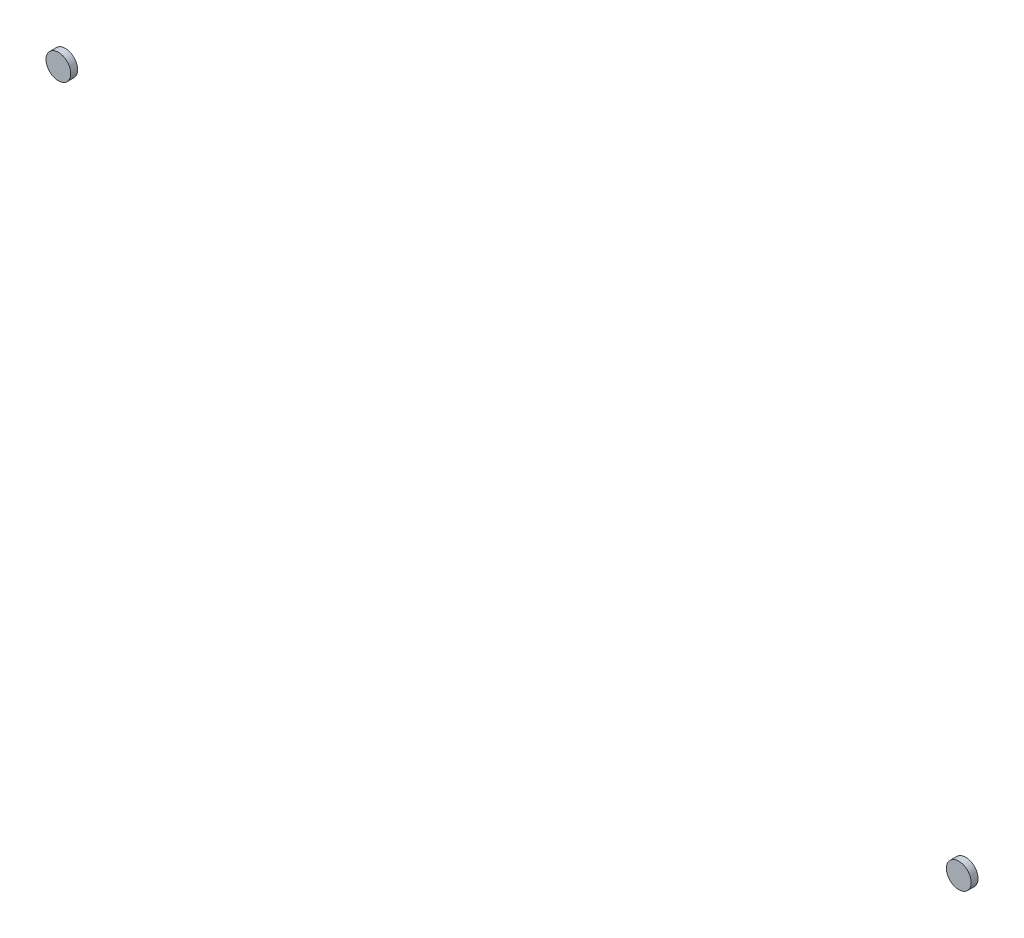
ISO-10303-21;
HEADER;
FILE_DESCRIPTION(('STEP AP214'),'2;1');
FILE_NAME('part.step','',(''),(''),'','','');
FILE_SCHEMA(('AUTOMOTIVE_DESIGN { 1 0 10303 214 1 1 1 1 }'));
ENDSEC;
DATA;
#1=APPLICATION_CONTEXT('core data for automotive mechanical design processes');
#2=APPLICATION_PROTOCOL_DEFINITION('international standard','automotive_design',2000,#1);
#3=PRODUCT_CONTEXT('',#1,'mechanical');
#4=PRODUCT('Part','Part','',(#3));
#5=PRODUCT_RELATED_PRODUCT_CATEGORY('part','',(#4));
#6=PRODUCT_DEFINITION_FORMATION('','',#4);
#7=PRODUCT_DEFINITION_CONTEXT('part definition',#1,'design');
#8=PRODUCT_DEFINITION('design','',#6,#7);
#9=PRODUCT_DEFINITION_SHAPE('','',#8);
#10=(LENGTH_UNIT() NAMED_UNIT(*) SI_UNIT(.MILLI.,.METRE.));
#11=(NAMED_UNIT(*) PLANE_ANGLE_UNIT() SI_UNIT($,.RADIAN.));
#12=(NAMED_UNIT(*) SI_UNIT($,.STERADIAN.) SOLID_ANGLE_UNIT());
#13=UNCERTAINTY_MEASURE_WITH_UNIT(LENGTH_MEASURE(1.E-05),#10,'distance_accuracy_value','');
#14=(GEOMETRIC_REPRESENTATION_CONTEXT(3) GLOBAL_UNCERTAINTY_ASSIGNED_CONTEXT((#13)) GLOBAL_UNIT_ASSIGNED_CONTEXT((#10,
#11,#12)) REPRESENTATION_CONTEXT('',''));
#15=CARTESIAN_POINT('',(0.,0.,0.));
#16=DIRECTION('',(0.,0.,1.));
#17=DIRECTION('',(1.,0.,0.));
#18=AXIS2_PLACEMENT_3D('',#15,#16,#17);
#19=CARTESIAN_POINT('',(13.8400021363873,12.4809647029919,-0.253998963258981));
#20=DIRECTION('',(0.,-8.74227339409092E-08,1.));
#21=DIRECTION('',(1.,-8.74227765734792E-08,0.));
#22=AXIS2_PLACEMENT_3D('',#19,#20,#21);
#23=PLANE('',#22);
#24=CARTESIAN_POINT('',(14.2972021363873,12.4809646630223,-0.253998963258985));
#25=DIRECTION('',(0.,8.74227339409092E-08,-1.));
#26=DIRECTION('',(-1.,8.74227765734792E-08,0.));
#27=AXIS2_PLACEMENT_3D('',#24,#25,#26);
#28=CIRCLE('',#27,0.4572);
#29=CARTESIAN_POINT('',(13.8400021363873,12.480964702992,-0.253998963258982));
#30=VERTEX_POINT('',#29);
#31=EDGE_CURVE('P0_E10',#30,#30,#28,.T.);
#32=ORIENTED_EDGE('',*,*,#31,.T.);
#33=EDGE_LOOP('',(#32));
#34=FACE_BOUND('',#33,.T.);
#35=ADVANCED_FACE('P0_F15',(#34),#23,.F.);
#36=CARTESIAN_POINT('',(13.8400021363873,12.4809646807866,1.0367410172539E-06));
#37=DIRECTION('',(0.,-8.74227339409092E-08,1.));
#38=DIRECTION('',(1.,-8.74227765734792E-08,0.));
#39=AXIS2_PLACEMENT_3D('',#36,#37,#38);
#40=PLANE('',#39);
#41=CARTESIAN_POINT('',(14.2972021363873,12.4809646408169,1.03674101378445E-06));
#42=DIRECTION('',(0.,8.74227339409092E-08,-1.));
#43=DIRECTION('',(-1.,8.74227765734792E-08,0.));
#44=AXIS2_PLACEMENT_3D('',#41,#42,#43);
#45=CIRCLE('',#44,0.4572);
#46=CARTESIAN_POINT('',(13.8400021363873,12.4809646807866,1.03674101727871E-06));
#47=VERTEX_POINT('',#46);
#48=EDGE_CURVE('P0_E22',#47,#47,#45,.T.);
#49=ORIENTED_EDGE('',*,*,#48,.F.);
#50=EDGE_LOOP('',(#49));
#51=FACE_BOUND('',#50,.T.);
#52=ADVANCED_FACE('P0_F35',(#51),#40,.T.);
#53=CARTESIAN_POINT('',(14.2972021363873,12.4809646408169,1.03674101378445E-06));
#54=DIRECTION('',(0.,-8.74227339409092E-08,1.));
#55=DIRECTION('',(-1.,8.74227765734792E-08,0.));
#56=AXIS2_PLACEMENT_3D('',#53,#54,#55);
#57=CYLINDRICAL_SURFACE('',#56,0.4572);
#58=ORIENTED_EDGE('',*,*,#31,.F.);
#59=EDGE_LOOP('',(#58));
#60=FACE_BOUND('',#59,.T.);
#61=ORIENTED_EDGE('',*,*,#48,.T.);
#62=EDGE_LOOP('',(#61));
#63=FACE_BOUND('',#62,.T.);
#64=ADVANCED_FACE('P0_F33',(#60,#63),#57,.T.);
#65=CLOSED_SHELL('',(#35,#52,#64));
#66=MANIFOLD_SOLID_BREP('P0_B1',#65);
#67=CARTESIAN_POINT('',(-18.9777993840402,22.1881646630226,-0.253998923289316));
#68=DIRECTION('',(0.,-8.74227339409095E-08,1.));
#69=DIRECTION('',(-1.19248806384999E-08,-1.,-8.74227339409095E-08));
#70=AXIS2_PLACEMENT_3D('',#67,#68,#69);
#71=PLANE('',#70);
#72=CARTESIAN_POINT('',(-18.9777993894923,21.7309646630225,-0.253998963258991));
#73=DIRECTION('',(0.,8.74227339409095E-08,-1.));
#74=DIRECTION('',(1.19248806384999E-08,1.,8.74227339409095E-08));
#75=AXIS2_PLACEMENT_3D('',#72,#73,#74);
#76=CIRCLE('',#75,0.4572);
#77=CARTESIAN_POINT('',(-18.9777993840402,22.1881646630226,-0.253998923289317));
#78=VERTEX_POINT('',#77);
#79=EDGE_CURVE('P1_E10',#78,#78,#76,.T.);
#80=ORIENTED_EDGE('',*,*,#79,.T.);
#81=EDGE_LOOP('',(#80));
#82=FACE_BOUND('',#81,.T.);
#83=ADVANCED_FACE('P1_F15',(#82),#71,.F.);
#84=CARTESIAN_POINT('',(-18.9777993840402,22.1881646408171,1.07671068285201E-06));
#85=DIRECTION('',(0.,-8.74227339409095E-08,1.));
#86=DIRECTION('',(-1.19248806384999E-08,-1.,-8.74227339409095E-08));
#87=AXIS2_PLACEMENT_3D('',#84,#85,#86);
#88=PLANE('',#87);
#89=CARTESIAN_POINT('',(-18.9777993894923,21.7309646408171,1.03674100901396E-06));
#90=DIRECTION('',(0.,8.74227339409095E-08,-1.));
#91=DIRECTION('',(1.19248806384999E-08,1.,8.74227339409095E-08));
#92=AXIS2_PLACEMENT_3D('',#89,#90,#91);
#93=CIRCLE('',#92,0.4572);
#94=CARTESIAN_POINT('',(-18.9777993840402,22.1881646408171,1.07671068297175E-06));
#95=VERTEX_POINT('',#94);
#96=EDGE_CURVE('P1_E22',#95,#95,#93,.T.);
#97=ORIENTED_EDGE('',*,*,#96,.F.);
#98=EDGE_LOOP('',(#97));
#99=FACE_BOUND('',#98,.T.);
#100=ADVANCED_FACE('P1_F35',(#99),#88,.T.);
#101=CARTESIAN_POINT('',(-18.9777993894923,21.7309646408171,1.03674100901396E-06));
#102=DIRECTION('',(0.,-8.74227339409095E-08,1.));
#103=DIRECTION('',(1.19248806384999E-08,1.,8.74227339409095E-08));
#104=AXIS2_PLACEMENT_3D('',#101,#102,#103);
#105=CYLINDRICAL_SURFACE('',#104,0.4572);
#106=ORIENTED_EDGE('',*,*,#79,.F.);
#107=EDGE_LOOP('',(#106));
#108=FACE_BOUND('',#107,.T.);
#109=ORIENTED_EDGE('',*,*,#96,.T.);
#110=EDGE_LOOP('',(#109));
#111=FACE_BOUND('',#110,.T.);
#112=ADVANCED_FACE('P1_F33',(#108,#111),#105,.T.);
#113=CLOSED_SHELL('',(#83,#100,#112));
#114=MANIFOLD_SOLID_BREP('P1_B1',#113);
#115=ADVANCED_BREP_SHAPE_REPRESENTATION('',(#18,#66,#114),#14);
#116=SHAPE_DEFINITION_REPRESENTATION(#9,#115);
ENDSEC;
END-ISO-10303-21;
